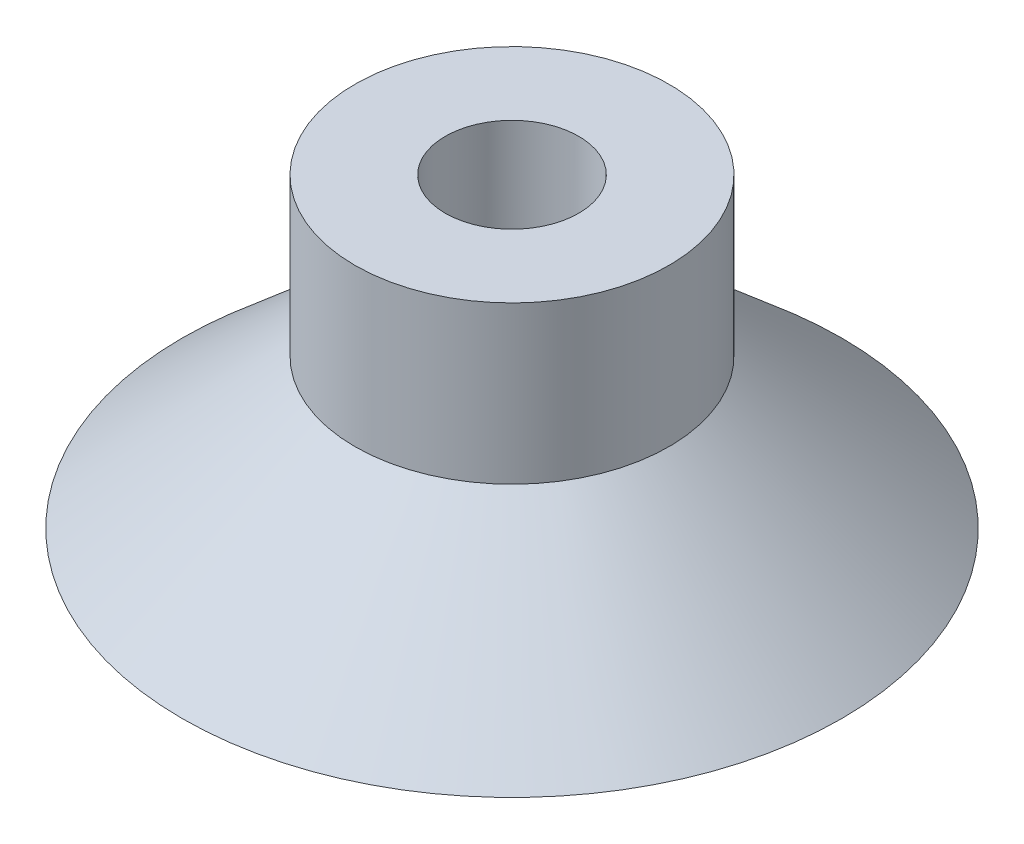
ISO-10303-21;
HEADER;
FILE_DESCRIPTION(('STEP AP214'),'2;1');
FILE_NAME('part.step','',(''),(''),'','','');
FILE_SCHEMA(('AUTOMOTIVE_DESIGN { 1 0 10303 214 1 1 1 1 }'));
ENDSEC;
DATA;
#1=APPLICATION_CONTEXT('core data for automotive mechanical design processes');
#2=APPLICATION_PROTOCOL_DEFINITION('international standard','automotive_design',2000,#1);
#3=PRODUCT_CONTEXT('',#1,'mechanical');
#4=PRODUCT('Part','Part','',(#3));
#5=PRODUCT_RELATED_PRODUCT_CATEGORY('part','',(#4));
#6=PRODUCT_DEFINITION_FORMATION('','',#4);
#7=PRODUCT_DEFINITION_CONTEXT('part definition',#1,'design');
#8=PRODUCT_DEFINITION('design','',#6,#7);
#9=PRODUCT_DEFINITION_SHAPE('','',#8);
#10=(LENGTH_UNIT() NAMED_UNIT(*) SI_UNIT(.MILLI.,.METRE.));
#11=(NAMED_UNIT(*) PLANE_ANGLE_UNIT() SI_UNIT($,.RADIAN.));
#12=(NAMED_UNIT(*) SI_UNIT($,.STERADIAN.) SOLID_ANGLE_UNIT());
#13=UNCERTAINTY_MEASURE_WITH_UNIT(LENGTH_MEASURE(1.E-05),#10,'distance_accuracy_value','');
#14=(GEOMETRIC_REPRESENTATION_CONTEXT(3) GLOBAL_UNCERTAINTY_ASSIGNED_CONTEXT((#13)) GLOBAL_UNIT_ASSIGNED_CONTEXT((#10,
#11,#12)) REPRESENTATION_CONTEXT('',''));
#15=CARTESIAN_POINT('',(0.,0.,0.));
#16=DIRECTION('',(0.,0.,1.));
#17=DIRECTION('',(1.,0.,0.));
#18=AXIS2_PLACEMENT_3D('',#15,#16,#17);
#19=CARTESIAN_POINT('',(0.,0.,0.));
#20=DIRECTION('',(0.,1.,0.));
#21=DIRECTION('',(0.,0.,1.));
#22=AXIS2_PLACEMENT_3D('',#19,#20,#21);
#23=PLANE('',#22);
#24=CARTESIAN_POINT('',(0.,0.,0.));
#25=DIRECTION('',(0.,1.,0.));
#26=DIRECTION('',(0.,0.,1.));
#27=AXIS2_PLACEMENT_3D('',#24,#25,#26);
#28=CIRCLE('',#27,21.);
#29=CARTESIAN_POINT('',(0.,0.,21.));
#30=VERTEX_POINT('',#29);
#31=EDGE_CURVE('E10',#30,#30,#28,.T.);
#32=ORIENTED_EDGE('',*,*,#31,.F.);
#33=EDGE_LOOP('',(#32));
#34=FACE_BOUND('',#33,.T.);
#35=CARTESIAN_POINT('',(0.,0.,0.));
#36=DIRECTION('',(0.,1.,0.));
#37=DIRECTION('',(0.,0.,1.));
#38=AXIS2_PLACEMENT_3D('',#35,#36,#37);
#39=CIRCLE('',#38,20.2350293761185);
#40=CARTESIAN_POINT('',(0.,0.,20.2350293761185));
#41=VERTEX_POINT('',#40);
#42=EDGE_CURVE('E60',#41,#41,#39,.T.);
#43=ORIENTED_EDGE('',*,*,#42,.T.);
#44=EDGE_LOOP('',(#43));
#45=FACE_BOUND('',#44,.T.);
#46=ADVANCED_FACE('F41',(#34,#45),#23,.F.);
#47=CARTESIAN_POINT('',(0.,0.,0.));
#48=DIRECTION('',(0.,-1.,0.));
#49=DIRECTION('',(0.,0.,-1.));
#50=AXIS2_PLACEMENT_3D('',#47,#48,#49);
#51=CONICAL_SURFACE('',#50,21.,0.858438728700568);
#52=CARTESIAN_POINT('',(0.,9.5,0.));
#53=DIRECTION('',(0.,1.,0.));
#54=DIRECTION('',(0.,0.,1.));
#55=AXIS2_PLACEMENT_3D('',#52,#53,#54);
#56=CIRCLE('',#55,10.);
#57=CARTESIAN_POINT('',(0.,9.5,10.));
#58=VERTEX_POINT('',#57);
#59=EDGE_CURVE('E48',#58,#58,#56,.T.);
#60=ORIENTED_EDGE('',*,*,#59,.F.);
#61=EDGE_LOOP('',(#60));
#62=FACE_BOUND('',#61,.T.);
#63=ORIENTED_EDGE('',*,*,#31,.T.);
#64=EDGE_LOOP('',(#63));
#65=FACE_BOUND('',#64,.T.);
#66=ADVANCED_FACE('F86',(#62,#65),#51,.T.);
#67=CARTESIAN_POINT('',(0.,59.4316669474915,0.));
#68=DIRECTION('',(0.,1.,0.));
#69=DIRECTION('',(0.,0.,1.));
#70=AXIS2_PLACEMENT_3D('',#67,#68,#69);
#71=CYLINDRICAL_SURFACE('',#70,10.);
#72=CARTESIAN_POINT('',(0.,19.5,0.));
#73=DIRECTION('',(0.,1.,0.));
#74=DIRECTION('',(0.,0.,1.));
#75=AXIS2_PLACEMENT_3D('',#72,#73,#74);
#76=CIRCLE('',#75,10.);
#77=CARTESIAN_POINT('',(0.,19.5,10.));
#78=VERTEX_POINT('',#77);
#79=EDGE_CURVE('E52',#78,#78,#76,.T.);
#80=ORIENTED_EDGE('',*,*,#79,.F.);
#81=EDGE_LOOP('',(#80));
#82=FACE_BOUND('',#81,.T.);
#83=ORIENTED_EDGE('',*,*,#59,.T.);
#84=EDGE_LOOP('',(#83));
#85=FACE_BOUND('',#84,.T.);
#86=ADVANCED_FACE('F92',(#82,#85),#71,.T.);
#87=CARTESIAN_POINT('',(10.,19.5,0.));
#88=DIRECTION('',(0.,-1.,0.));
#89=DIRECTION('',(0.,0.,-1.));
#90=AXIS2_PLACEMENT_3D('',#87,#88,#89);
#91=PLANE('',#90);
#92=CARTESIAN_POINT('',(0.,19.5,0.));
#93=DIRECTION('',(0.,1.,0.));
#94=DIRECTION('',(0.,0.,1.));
#95=AXIS2_PLACEMENT_3D('',#92,#93,#94);
#96=CIRCLE('',#95,4.25);
#97=CARTESIAN_POINT('',(0.,19.5,4.25));
#98=VERTEX_POINT('',#97);
#99=EDGE_CURVE('E63',#98,#98,#96,.T.);
#100=ORIENTED_EDGE('',*,*,#99,.F.);
#101=EDGE_LOOP('',(#100));
#102=FACE_BOUND('',#101,.T.);
#103=ORIENTED_EDGE('',*,*,#79,.T.);
#104=EDGE_LOOP('',(#103));
#105=FACE_BOUND('',#104,.T.);
#106=ADVANCED_FACE('F81',(#102,#105),#91,.F.);
#107=CARTESIAN_POINT('',(0.,0.,0.));
#108=DIRECTION('',(0.,-1.,0.));
#109=DIRECTION('',(0.,0.,-1.));
#110=AXIS2_PLACEMENT_3D('',#107,#108,#109);
#111=CONICAL_SURFACE('',#110,20.2350293761185,0.858438728700568);
#112=CARTESIAN_POINT('',(0.,8.,0.));
#113=DIRECTION('',(0.,1.,0.));
#114=DIRECTION('',(0.,0.,1.));
#115=AXIS2_PLACEMENT_3D('',#112,#113,#114);
#116=CIRCLE('',#115,10.9718714813817);
#117=CARTESIAN_POINT('',(0.,8.,10.9718714813817));
#118=VERTEX_POINT('',#117);
#119=EDGE_CURVE('E57',#118,#118,#116,.T.);
#120=ORIENTED_EDGE('',*,*,#119,.T.);
#121=EDGE_LOOP('',(#120));
#122=FACE_BOUND('',#121,.T.);
#123=ORIENTED_EDGE('',*,*,#42,.F.);
#124=EDGE_LOOP('',(#123));
#125=FACE_BOUND('',#124,.T.);
#126=ADVANCED_FACE('F75',(#122,#125),#111,.F.);
#127=CARTESIAN_POINT('',(0.,8.,0.));
#128=DIRECTION('',(0.,-1.,0.));
#129=DIRECTION('',(0.,0.,-1.));
#130=AXIS2_PLACEMENT_3D('',#127,#128,#129);
#131=PLANE('',#130);
#132=CARTESIAN_POINT('',(0.,8.,0.));
#133=DIRECTION('',(0.,-1.,0.));
#134=DIRECTION('',(0.,0.,-1.));
#135=AXIS2_PLACEMENT_3D('',#132,#133,#134);
#136=CIRCLE('',#135,4.24999999999999);
#137=CARTESIAN_POINT('',(0.,8.,-4.24999999999999));
#138=VERTEX_POINT('',#137);
#139=EDGE_CURVE('E44',#138,#138,#136,.T.);
#140=ORIENTED_EDGE('',*,*,#139,.F.);
#141=EDGE_LOOP('',(#140));
#142=FACE_BOUND('',#141,.T.);
#143=ORIENTED_EDGE('',*,*,#119,.F.);
#144=EDGE_LOOP('',(#143));
#145=FACE_BOUND('',#144,.T.);
#146=ADVANCED_FACE('F72',(#142,#145),#131,.T.);
#147=CARTESIAN_POINT('',(0.,19.5,0.));
#148=DIRECTION('',(0.,1.,0.));
#149=DIRECTION('',(0.,0.,1.));
#150=AXIS2_PLACEMENT_3D('',#147,#148,#149);
#151=CYLINDRICAL_SURFACE('',#150,4.24999999999999);
#152=ORIENTED_EDGE('',*,*,#139,.T.);
#153=EDGE_LOOP('',(#152));
#154=FACE_BOUND('',#153,.T.);
#155=ORIENTED_EDGE('',*,*,#99,.T.);
#156=EDGE_LOOP('',(#155));
#157=FACE_BOUND('',#156,.T.);
#158=ADVANCED_FACE('F70',(#154,#157),#151,.F.);
#159=CLOSED_SHELL('',(#46,#66,#86,#106,#126,#146,#158));
#160=MANIFOLD_SOLID_BREP('B2',#159);
#161=ADVANCED_BREP_SHAPE_REPRESENTATION('',(#18,#160),#14);
#162=SHAPE_DEFINITION_REPRESENTATION(#9,#161);
ENDSEC;
END-ISO-10303-21;
